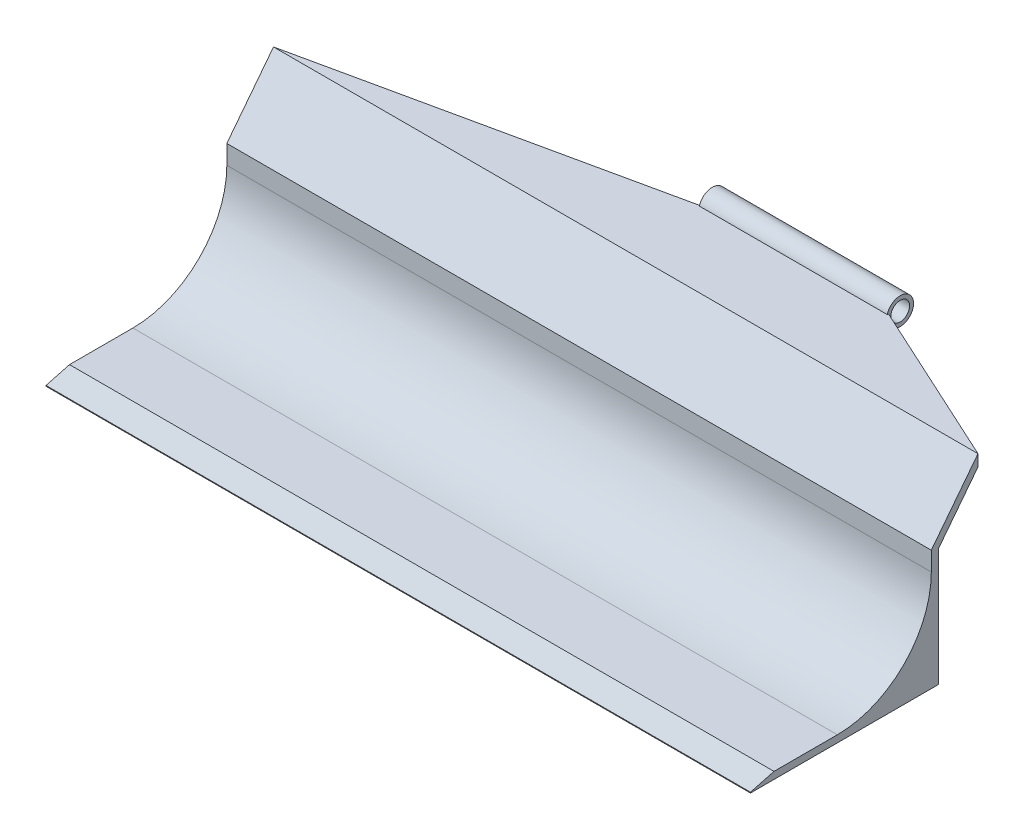
ISO-10303-21;
HEADER;
FILE_DESCRIPTION(('STEP AP214'),'2;1');
FILE_NAME('part.step','',(''),(''),'','','');
FILE_SCHEMA(('AUTOMOTIVE_DESIGN { 1 0 10303 214 1 1 1 1 }'));
ENDSEC;
DATA;
#1=APPLICATION_CONTEXT('core data for automotive mechanical design processes');
#2=APPLICATION_PROTOCOL_DEFINITION('international standard','automotive_design',2000,#1);
#3=PRODUCT_CONTEXT('',#1,'mechanical');
#4=PRODUCT('Part','Part','',(#3));
#5=PRODUCT_RELATED_PRODUCT_CATEGORY('part','',(#4));
#6=PRODUCT_DEFINITION_FORMATION('','',#4);
#7=PRODUCT_DEFINITION_CONTEXT('part definition',#1,'design');
#8=PRODUCT_DEFINITION('design','',#6,#7);
#9=PRODUCT_DEFINITION_SHAPE('','',#8);
#10=(LENGTH_UNIT() NAMED_UNIT(*) SI_UNIT(.MILLI.,.METRE.));
#11=(NAMED_UNIT(*) PLANE_ANGLE_UNIT() SI_UNIT($,.RADIAN.));
#12=(NAMED_UNIT(*) SI_UNIT($,.STERADIAN.) SOLID_ANGLE_UNIT());
#13=UNCERTAINTY_MEASURE_WITH_UNIT(LENGTH_MEASURE(1.E-05),#10,'distance_accuracy_value','');
#14=(GEOMETRIC_REPRESENTATION_CONTEXT(3) GLOBAL_UNCERTAINTY_ASSIGNED_CONTEXT((#13)) GLOBAL_UNIT_ASSIGNED_CONTEXT((#10,
#11,#12)) REPRESENTATION_CONTEXT('',''));
#15=CARTESIAN_POINT('',(0.,0.,0.));
#16=DIRECTION('',(0.,0.,1.));
#17=DIRECTION('',(1.,0.,0.));
#18=AXIS2_PLACEMENT_3D('',#15,#16,#17);
#19=CARTESIAN_POINT('',(300.,15.3974455765808,-106.273520759219));
#20=DIRECTION('',(0.,1.,0.));
#21=DIRECTION('',(0.,0.,1.));
#22=AXIS2_PLACEMENT_3D('',#19,#20,#21);
#23=PLANE('',#22);
#24=DIRECTION('',(0.,0.,-1.));
#25=VECTOR('',#24,1.);
#26=CARTESIAN_POINT('',(149.364416539226,15.3974455765808,-106.273520759219));
#27=LINE('',#26,#25);
#28=CARTESIAN_POINT('',(149.364416539226,15.3974455765808,-136.786178247801));
#29=VERTEX_POINT('',#28);
#30=CARTESIAN_POINT('',(149.364416539226,15.3974455765808,-137.151963568001));
#31=VERTEX_POINT('',#30);
#32=EDGE_CURVE('E58',#29,#31,#27,.T.);
#33=ORIENTED_EDGE('',*,*,#32,.F.);
#34=DIRECTION('',(1.,0.,0.));
#35=VECTOR('',#34,1.);
#36=CARTESIAN_POINT('',(149.364416539226,15.3974455765808,-136.786178247801));
#37=LINE('',#36,#35);
#38=CARTESIAN_POINT('',(229.364416539226,15.3974455765808,-136.786178247801));
#39=VERTEX_POINT('',#38);
#40=EDGE_CURVE('E62',#29,#39,#37,.T.);
#41=ORIENTED_EDGE('',*,*,#40,.T.);
#42=DIRECTION('',(0.,0.,-1.));
#43=VECTOR('',#42,1.);
#44=CARTESIAN_POINT('',(229.364416539226,15.3974455765808,-106.273520759219));
#45=LINE('',#44,#43);
#46=CARTESIAN_POINT('',(229.364416539226,15.3974455765808,-137.289614993244));
#47=VERTEX_POINT('',#46);
#48=EDGE_CURVE('E177',#39,#47,#45,.T.);
#49=ORIENTED_EDGE('',*,*,#48,.T.);
#50=DIRECTION('',(0.908520400379815,0.,0.41784049838868));
#51=VECTOR('',#50,1.);
#52=CARTESIAN_POINT('',(299.44191006579,15.3974455765808,-105.060052719543));
#53=LINE('',#52,#51);
#54=CARTESIAN_POINT('',(296.803438032788,15.3974455765808,-106.273520759219));
#55=VERTEX_POINT('',#54);
#56=EDGE_CURVE('E154',#47,#55,#53,.T.);
#57=ORIENTED_EDGE('',*,*,#56,.T.);
#58=DIRECTION('',(-1.,0.,0.));
#59=VECTOR('',#58,1.);
#60=CARTESIAN_POINT('',(300.,15.3974455765808,-106.273520759219));
#61=LINE('',#60,#59);
#62=CARTESIAN_POINT('',(6.78814092826346,15.3974455765808,-106.273520759219));
#63=VERTEX_POINT('',#62);
#64=EDGE_CURVE('E274',#55,#63,#61,.T.);
#65=ORIENTED_EDGE('',*,*,#64,.T.);
#66=DIRECTION('',(0.977341696957803,0.,-0.211667681490687));
#67=VECTOR('',#66,1.);
#68=CARTESIAN_POINT('',(286.863168269493,15.3974455765808,-166.930742143807));
#69=LINE('',#68,#67);
#70=EDGE_CURVE('E158',#63,#31,#69,.T.);
#71=ORIENTED_EDGE('',*,*,#70,.T.);
#72=EDGE_LOOP('',(#33,#41,#49,#57,#65,#71));
#73=FACE_BOUND('',#72,.T.);
#74=ADVANCED_FACE('F41',(#73),#23,.F.);
#75=CARTESIAN_POINT('',(300.,18.3974455765808,-104.803379808116));
#76=DIRECTION('',(0.,-1.,0.));
#77=DIRECTION('',(0.,0.,-1.));
#78=AXIS2_PLACEMENT_3D('',#75,#76,#77);
#79=PLANE('',#78);
#80=DIRECTION('',(0.,0.,1.));
#81=VECTOR('',#80,1.);
#82=CARTESIAN_POINT('',(149.364416539226,18.3974455765808,-104.803379808116));
#83=LINE('',#82,#81);
#84=CARTESIAN_POINT('',(149.364416539226,18.3974455765808,-137.151963568001));
#85=VERTEX_POINT('',#84);
#86=CARTESIAN_POINT('',(149.364416539226,18.3974455765808,-136.786178247801));
#87=VERTEX_POINT('',#86);
#88=EDGE_CURVE('E182',#85,#87,#83,.T.);
#89=ORIENTED_EDGE('',*,*,#88,.F.);
#90=DIRECTION('',(0.977341696957802,0.,-0.211667681490687));
#91=VECTOR('',#90,1.);
#92=CARTESIAN_POINT('',(150.,18.3974455765808,-137.289614993244));
#93=LINE('',#92,#91);
#94=CARTESIAN_POINT('',(0.,18.3974455765808,-104.803379808116));
#95=VERTEX_POINT('',#94);
#96=EDGE_CURVE('E170',#95,#85,#93,.T.);
#97=ORIENTED_EDGE('',*,*,#96,.F.);
#98=DIRECTION('',(-1.,0.,0.));
#99=VECTOR('',#98,1.);
#100=CARTESIAN_POINT('',(300.,18.3974455765808,-104.803379808116));
#101=LINE('',#100,#99);
#102=CARTESIAN_POINT('',(300.,18.3974455765808,-104.803379808116));
#103=VERTEX_POINT('',#102);
#104=EDGE_CURVE('E167',#103,#95,#101,.T.);
#105=ORIENTED_EDGE('',*,*,#104,.F.);
#106=DIRECTION('',(0.908520400379815,0.,0.41784049838868));
#107=VECTOR('',#106,1.);
#108=CARTESIAN_POINT('',(229.364416539226,18.3974455765808,-137.289614993244));
#109=LINE('',#108,#107);
#110=CARTESIAN_POINT('',(229.364416539226,18.3974455765808,-137.289614993244));
#111=VERTEX_POINT('',#110);
#112=EDGE_CURVE('E151',#111,#103,#109,.T.);
#113=ORIENTED_EDGE('',*,*,#112,.F.);
#114=DIRECTION('',(0.,0.,1.));
#115=VECTOR('',#114,1.);
#116=CARTESIAN_POINT('',(229.364416539226,18.3974455765808,-104.803379808116));
#117=LINE('',#116,#115);
#118=CARTESIAN_POINT('',(229.364416539226,18.3974455765808,-136.786178247801));
#119=VERTEX_POINT('',#118);
#120=EDGE_CURVE('E163',#111,#119,#117,.T.);
#121=ORIENTED_EDGE('',*,*,#120,.T.);
#122=DIRECTION('',(1.,0.,0.));
#123=VECTOR('',#122,1.);
#124=CARTESIAN_POINT('',(149.364416539226,18.3974455765808,-136.786178247801));
#125=LINE('',#124,#123);
#126=EDGE_CURVE('E11',#119,#87,#125,.F.);
#127=ORIENTED_EDGE('',*,*,#126,.T.);
#128=EDGE_LOOP('',(#89,#97,#105,#113,#121,#127));
#129=FACE_BOUND('',#128,.T.);
#130=ADVANCED_FACE('F162',(#129),#79,.F.);
#131=CARTESIAN_POINT('',(150.,-58.3162100456621,-137.289614993244));
#132=DIRECTION('',(0.211667681490687,0.,0.977341696957802));
#133=DIRECTION('',(0.977341696957803,0.,-0.211667681490687));
#134=AXIS2_PLACEMENT_3D('',#131,#132,#133);
#135=PLANE('',#134);
#136=DIRECTION('',(0.,1.,0.));
#137=VECTOR('',#136,1.);
#138=CARTESIAN_POINT('',(149.364416539226,-58.3162100456621,-137.151963568001));
#139=LINE('',#138,#137);
#140=EDGE_CURVE('E51',#31,#85,#139,.T.);
#141=ORIENTED_EDGE('',*,*,#140,.F.);
#142=ORIENTED_EDGE('',*,*,#70,.F.);
#143=DIRECTION('',(0.942834164959056,0.263378927544148,-0.204194216156223));
#144=VECTOR('',#143,1.);
#145=CARTESIAN_POINT('',(258.023977464954,85.5796978187491,-160.68489724364));
#146=LINE('',#145,#144);
#147=CARTESIAN_POINT('',(0.,13.5011913421129,-104.803379808116));
#148=VERTEX_POINT('',#147);
#149=EDGE_CURVE('E200',#148,#63,#146,.T.);
#150=ORIENTED_EDGE('',*,*,#149,.F.);
#151=DIRECTION('',(0.,-1.,0.));
#152=VECTOR('',#151,1.);
#153=CARTESIAN_POINT('',(0.,0.,-104.803379808116));
#154=LINE('',#153,#152);
#155=EDGE_CURVE('E308',#95,#148,#154,.T.);
#156=ORIENTED_EDGE('',*,*,#155,.F.);
#157=ORIENTED_EDGE('',*,*,#96,.T.);
#158=EDGE_LOOP('',(#141,#142,#150,#156,#157));
#159=FACE_BOUND('',#158,.T.);
#160=ADVANCED_FACE('F320',(#159),#135,.F.);
#161=CARTESIAN_POINT('',(300.,-8.27269224897838,-87.9223744292238));
#162=DIRECTION('',(0.,0.,1.));
#163=DIRECTION('',(0.,-1.,0.));
#164=AXIS2_PLACEMENT_3D('',#161,#162,#163);
#165=PLANE('',#164);
#166=DIRECTION('',(0.,1.,0.));
#167=VECTOR('',#166,1.);
#168=CARTESIAN_POINT('',(0.,-8.27269224897838,-87.9223744292238));
#169=LINE('',#168,#167);
#170=CARTESIAN_POINT('',(0.,-58.3162100456621,-87.9223744292238));
#171=VERTEX_POINT('',#170);
#172=CARTESIAN_POINT('',(0.,-8.27269224897838,-87.9223744292238));
#173=VERTEX_POINT('',#172);
#174=EDGE_CURVE('E210',#171,#173,#169,.T.);
#175=ORIENTED_EDGE('',*,*,#174,.T.);
#176=DIRECTION('',(-1.,0.,0.));
#177=VECTOR('',#176,1.);
#178=CARTESIAN_POINT('',(300.,-8.27269224897838,-87.9223744292238));
#179=LINE('',#178,#177);
#180=CARTESIAN_POINT('',(300.,-8.27269224897838,-87.9223744292238));
#181=VERTEX_POINT('',#180);
#182=EDGE_CURVE('E278',#181,#173,#179,.T.);
#183=ORIENTED_EDGE('',*,*,#182,.F.);
#184=DIRECTION('',(0.,1.,0.));
#185=VECTOR('',#184,1.);
#186=CARTESIAN_POINT('',(300.,-8.27269224897838,-87.9223744292238));
#187=LINE('',#186,#185);
#188=CARTESIAN_POINT('',(300.,-58.3162100456621,-87.9223744292238));
#189=VERTEX_POINT('',#188);
#190=EDGE_CURVE('E211',#189,#181,#187,.T.);
#191=ORIENTED_EDGE('',*,*,#190,.F.);
#192=DIRECTION('',(-1.,0.,0.));
#193=VECTOR('',#192,1.);
#194=CARTESIAN_POINT('',(300.,-58.3162100456621,-87.9223744292238));
#195=LINE('',#194,#193);
#196=EDGE_CURVE('E237',#189,#171,#195,.T.);
#197=ORIENTED_EDGE('',*,*,#196,.T.);
#198=EDGE_LOOP('',(#175,#183,#191,#197));
#199=FACE_BOUND('',#198,.T.);
#200=ADVANCED_FACE('F363',(#199),#165,.F.);
#201=CARTESIAN_POINT('',(300.,-8.27269224897838,-87.9223744292238));
#202=DIRECTION('',(0.,0.612713281692178,0.79030527926745));
#203=DIRECTION('',(0.,-0.79030527926745,0.612713281692178));
#204=AXIS2_PLACEMENT_3D('',#201,#202,#203);
#205=PLANE('',#204);
#206=ORIENTED_EDGE('',*,*,#64,.F.);
#207=DIRECTION('',(0.799762975939563,-0.474432826659252,0.367821526428792));
#208=VECTOR('',#207,1.);
#209=CARTESIAN_POINT('',(313.227633598698,5.65433697770524,-98.7198168929941));
#210=LINE('',#209,#208);
#211=CARTESIAN_POINT('',(300.,13.5011913421129,-104.803379808116));
#212=VERTEX_POINT('',#211);
#213=EDGE_CURVE('E206',#55,#212,#210,.T.);
#214=ORIENTED_EDGE('',*,*,#213,.T.);
#215=DIRECTION('',(0.,0.79030527926745,-0.612713281692178));
#216=VECTOR('',#215,1.);
#217=CARTESIAN_POINT('',(300.,-8.27269224897838,-87.9223744292238));
#218=LINE('',#217,#216);
#219=EDGE_CURVE('E215',#181,#212,#218,.T.);
#220=ORIENTED_EDGE('',*,*,#219,.F.);
#221=ORIENTED_EDGE('',*,*,#182,.T.);
#222=DIRECTION('',(0.,0.79030527926745,-0.612713281692178));
#223=VECTOR('',#222,1.);
#224=CARTESIAN_POINT('',(0.,-8.27269224897838,-87.9223744292238));
#225=LINE('',#224,#223);
#226=EDGE_CURVE('E241',#173,#148,#225,.T.);
#227=ORIENTED_EDGE('',*,*,#226,.T.);
#228=ORIENTED_EDGE('',*,*,#149,.T.);
#229=EDGE_LOOP('',(#206,#214,#220,#221,#227,#228));
#230=FACE_BOUND('',#229,.T.);
#231=ADVANCED_FACE('F323',(#230),#205,.F.);
#232=CARTESIAN_POINT('',(300.,-7.2459735846461,-84.9223744292238));
#233=DIRECTION('',(0.,-0.612713281692177,-0.790305279267451));
#234=DIRECTION('',(0.,0.790305279267451,-0.612713281692177));
#235=AXIS2_PLACEMENT_3D('',#232,#233,#234);
#236=PLANE('',#235);
#237=DIRECTION('',(0.,-0.790305279267451,0.612713281692177));
#238=VECTOR('',#237,1.);
#239=CARTESIAN_POINT('',(0.,-7.2459735846461,-84.9223744292238));
#240=LINE('',#239,#238);
#241=CARTESIAN_POINT('',(0.,-7.2459735846461,-84.9223744292238));
#242=VERTEX_POINT('',#241);
#243=EDGE_CURVE('E245',#95,#242,#240,.T.);
#244=ORIENTED_EDGE('',*,*,#243,.T.);
#245=DIRECTION('',(-1.,0.,0.));
#246=VECTOR('',#245,1.);
#247=CARTESIAN_POINT('',(300.,-7.2459735846461,-84.9223744292238));
#248=LINE('',#247,#246);
#249=CARTESIAN_POINT('',(300.,-7.2459735846461,-84.9223744292238));
#250=VERTEX_POINT('',#249);
#251=EDGE_CURVE('E268',#250,#242,#248,.T.);
#252=ORIENTED_EDGE('',*,*,#251,.F.);
#253=DIRECTION('',(0.,-0.790305279267451,0.612713281692177));
#254=VECTOR('',#253,1.);
#255=CARTESIAN_POINT('',(300.,-7.2459735846461,-84.9223744292238));
#256=LINE('',#255,#254);
#257=EDGE_CURVE('E220',#103,#250,#256,.T.);
#258=ORIENTED_EDGE('',*,*,#257,.F.);
#259=ORIENTED_EDGE('',*,*,#104,.T.);
#260=EDGE_LOOP('',(#244,#252,#258,#259));
#261=FACE_BOUND('',#260,.T.);
#262=ADVANCED_FACE('F331',(#261),#236,.F.);
#263=CARTESIAN_POINT('',(300.,-7.2459735846461,-84.9223744292238));
#264=DIRECTION('',(0.,0.,-1.));
#265=DIRECTION('',(-1.,0.,0.));
#266=AXIS2_PLACEMENT_3D('',#263,#264,#265);
#267=PLANE('',#266);
#268=DIRECTION('',(0.,-1.,0.));
#269=VECTOR('',#268,1.);
#270=CARTESIAN_POINT('',(0.,-7.2459735846461,-84.9223744292238));
#271=LINE('',#270,#269);
#272=CARTESIAN_POINT('',(0.,-15.3162100456621,-84.9223744292238));
#273=VERTEX_POINT('',#272);
#274=EDGE_CURVE('E248',#242,#273,#271,.T.);
#275=ORIENTED_EDGE('',*,*,#274,.T.);
#276=DIRECTION('',(-1.,0.,0.));
#277=VECTOR('',#276,1.);
#278=CARTESIAN_POINT('',(300.,-15.3162100456621,-84.9223744292238));
#279=LINE('',#278,#277);
#280=CARTESIAN_POINT('',(300.,-15.3162100456621,-84.9223744292238));
#281=VERTEX_POINT('',#280);
#282=EDGE_CURVE('E286',#273,#281,#279,.F.);
#283=ORIENTED_EDGE('',*,*,#282,.T.);
#284=DIRECTION('',(0.,-1.,0.));
#285=VECTOR('',#284,1.);
#286=CARTESIAN_POINT('',(300.,-7.2459735846461,-84.9223744292238));
#287=LINE('',#286,#285);
#288=EDGE_CURVE('E223',#250,#281,#287,.T.);
#289=ORIENTED_EDGE('',*,*,#288,.F.);
#290=ORIENTED_EDGE('',*,*,#251,.T.);
#291=EDGE_LOOP('',(#275,#283,#289,#290));
#292=FACE_BOUND('',#291,.T.);
#293=ADVANCED_FACE('F334',(#292),#267,.F.);
#294=CARTESIAN_POINT('',(300.,-55.3162100456621,-7.92237442922378));
#295=DIRECTION('',(0.,-1.,0.));
#296=DIRECTION('',(0.,0.,-1.));
#297=AXIS2_PLACEMENT_3D('',#294,#295,#296);
#298=PLANE('',#297);
#299=DIRECTION('',(0.,0.,1.));
#300=VECTOR('',#299,1.);
#301=CARTESIAN_POINT('',(0.,-55.3162100456621,-7.92237442922378));
#302=LINE('',#301,#300);
#303=CARTESIAN_POINT('',(0.,-55.3162100456621,-44.9223744292238));
#304=VERTEX_POINT('',#303);
#305=CARTESIAN_POINT('',(0.,-55.3162100456621,-17.9223744292239));
#306=VERTEX_POINT('',#305);
#307=EDGE_CURVE('E252',#304,#306,#302,.T.);
#308=ORIENTED_EDGE('',*,*,#307,.T.);
#309=DIRECTION('',(1.,0.,0.));
#310=VECTOR('',#309,1.);
#311=CARTESIAN_POINT('',(300.,-55.3162100456621,-17.9223744292239));
#312=LINE('',#311,#310);
#313=CARTESIAN_POINT('',(300.,-55.3162100456621,-17.9223744292239));
#314=VERTEX_POINT('',#313);
#315=EDGE_CURVE('E302',#306,#314,#312,.T.);
#316=ORIENTED_EDGE('',*,*,#315,.T.);
#317=DIRECTION('',(0.,0.,1.));
#318=VECTOR('',#317,1.);
#319=CARTESIAN_POINT('',(300.,-55.3162100456621,-7.92237442922378));
#320=LINE('',#319,#318);
#321=CARTESIAN_POINT('',(300.,-55.3162100456621,-44.9223744292238));
#322=VERTEX_POINT('',#321);
#323=EDGE_CURVE('E227',#322,#314,#320,.T.);
#324=ORIENTED_EDGE('',*,*,#323,.F.);
#325=DIRECTION('',(-1.,0.,0.));
#326=VECTOR('',#325,1.);
#327=CARTESIAN_POINT('',(0.,-55.3162100456621,-44.9223744292238));
#328=LINE('',#327,#326);
#329=EDGE_CURVE('E282',#322,#304,#328,.T.);
#330=ORIENTED_EDGE('',*,*,#329,.T.);
#331=EDGE_LOOP('',(#308,#316,#324,#330));
#332=FACE_BOUND('',#331,.T.);
#333=ADVANCED_FACE('F345',(#332),#298,.F.);
#334=CARTESIAN_POINT('',(300.,-55.3162100456621,-7.92237442922378));
#335=DIRECTION('',(0.,0.,-1.));
#336=DIRECTION('',(-1.,0.,0.));
#337=AXIS2_PLACEMENT_3D('',#334,#335,#336);
#338=PLANE('',#337);
#339=DIRECTION('',(0.,-1.,0.));
#340=VECTOR('',#339,1.);
#341=CARTESIAN_POINT('',(300.,-55.3162100456621,-7.92237442922378));
#342=LINE('',#341,#340);
#343=CARTESIAN_POINT('',(300.,-57.9957019699733,-7.92237442922378));
#344=VERTEX_POINT('',#343);
#345=CARTESIAN_POINT('',(300.,-58.3162100456621,-7.92237442922378));
#346=VERTEX_POINT('',#345);
#347=EDGE_CURVE('E231',#344,#346,#342,.T.);
#348=ORIENTED_EDGE('',*,*,#347,.F.);
#349=DIRECTION('',(-1.,0.,0.));
#350=VECTOR('',#349,1.);
#351=CARTESIAN_POINT('',(300.,-57.9957019699733,-7.92237442922378));
#352=LINE('',#351,#350);
#353=CARTESIAN_POINT('',(0.,-57.9957019699733,-7.92237442922378));
#354=VERTEX_POINT('',#353);
#355=EDGE_CURVE('E295',#344,#354,#352,.T.);
#356=ORIENTED_EDGE('',*,*,#355,.T.);
#357=DIRECTION('',(0.,-1.,0.));
#358=VECTOR('',#357,1.);
#359=CARTESIAN_POINT('',(0.,-55.3162100456621,-7.92237442922378));
#360=LINE('',#359,#358);
#361=CARTESIAN_POINT('',(0.,-58.3162100456621,-7.92237442922378));
#362=VERTEX_POINT('',#361);
#363=EDGE_CURVE('E256',#354,#362,#360,.T.);
#364=ORIENTED_EDGE('',*,*,#363,.T.);
#365=DIRECTION('',(-1.,0.,0.));
#366=VECTOR('',#365,1.);
#367=CARTESIAN_POINT('',(300.,-58.3162100456621,-7.92237442922378));
#368=LINE('',#367,#366);
#369=EDGE_CURVE('E264',#346,#362,#368,.T.);
#370=ORIENTED_EDGE('',*,*,#369,.F.);
#371=EDGE_LOOP('',(#348,#356,#364,#370));
#372=FACE_BOUND('',#371,.T.);
#373=ADVANCED_FACE('F354',(#372),#338,.F.);
#374=CARTESIAN_POINT('',(300.,-58.3162100456621,-7.92237442922378));
#375=DIRECTION('',(0.,1.,0.));
#376=DIRECTION('',(0.,0.,1.));
#377=AXIS2_PLACEMENT_3D('',#374,#375,#376);
#378=PLANE('',#377);
#379=DIRECTION('',(0.,0.,-1.));
#380=VECTOR('',#379,1.);
#381=CARTESIAN_POINT('',(0.,-58.3162100456621,-7.92237442922378));
#382=LINE('',#381,#380);
#383=EDGE_CURVE('E216',#362,#171,#382,.T.);
#384=ORIENTED_EDGE('',*,*,#383,.T.);
#385=ORIENTED_EDGE('',*,*,#196,.F.);
#386=DIRECTION('',(0.,0.,-1.));
#387=VECTOR('',#386,1.);
#388=CARTESIAN_POINT('',(300.,-58.3162100456621,-7.92237442922378));
#389=LINE('',#388,#387);
#390=EDGE_CURVE('E234',#346,#189,#389,.T.);
#391=ORIENTED_EDGE('',*,*,#390,.F.);
#392=ORIENTED_EDGE('',*,*,#369,.T.);
#393=EDGE_LOOP('',(#384,#385,#391,#392));
#394=FACE_BOUND('',#393,.T.);
#395=ADVANCED_FACE('F361',(#394),#378,.F.);
#396=CARTESIAN_POINT('',(300.,0.,0.));
#397=DIRECTION('',(1.,0.,0.));
#398=DIRECTION('',(0.,0.,-1.));
#399=AXIS2_PLACEMENT_3D('',#396,#397,#398);
#400=PLANE('',#399);
#401=DIRECTION('',(0.,-1.,0.));
#402=VECTOR('',#401,1.);
#403=CARTESIAN_POINT('',(300.,0.,-104.803379808116));
#404=LINE('',#403,#402);
#405=EDGE_CURVE('E312',#103,#212,#404,.T.);
#406=ORIENTED_EDGE('',*,*,#405,.F.);
#407=ORIENTED_EDGE('',*,*,#257,.T.);
#408=ORIENTED_EDGE('',*,*,#288,.T.);
#409=CARTESIAN_POINT('',(300.,-15.3162100456621,-44.9223744292238));
#410=DIRECTION('',(1.,0.,0.));
#411=DIRECTION('',(0.,0.,-1.));
#412=AXIS2_PLACEMENT_3D('',#409,#410,#411);
#413=CIRCLE('',#412,40.);
#414=EDGE_CURVE('E292',#281,#322,#413,.F.);
#415=ORIENTED_EDGE('',*,*,#414,.T.);
#416=ORIENTED_EDGE('',*,*,#323,.T.);
#417=DIRECTION('',(0.,0.258819045102518,-0.965925826289069));
#418=VECTOR('',#417,1.);
#419=CARTESIAN_POINT('',(300.,-56.0913202004467,-15.0296239501051));
#420=LINE('',#419,#418);
#421=EDGE_CURVE('E305',#314,#344,#420,.F.);
#422=ORIENTED_EDGE('',*,*,#421,.T.);
#423=ORIENTED_EDGE('',*,*,#347,.T.);
#424=ORIENTED_EDGE('',*,*,#390,.T.);
#425=ORIENTED_EDGE('',*,*,#190,.T.);
#426=ORIENTED_EDGE('',*,*,#219,.T.);
#427=EDGE_LOOP('',(#406,#407,#408,#415,#416,#422,#423,#424,#425,#426));
#428=FACE_BOUND('',#427,.T.);
#429=ADVANCED_FACE('F338',(#428),#400,.T.);
#430=CARTESIAN_POINT('',(0.,0.,0.));
#431=DIRECTION('',(1.,0.,0.));
#432=DIRECTION('',(0.,0.,-1.));
#433=AXIS2_PLACEMENT_3D('',#430,#431,#432);
#434=PLANE('',#433);
#435=ORIENTED_EDGE('',*,*,#243,.F.);
#436=ORIENTED_EDGE('',*,*,#155,.T.);
#437=ORIENTED_EDGE('',*,*,#226,.F.);
#438=ORIENTED_EDGE('',*,*,#174,.F.);
#439=ORIENTED_EDGE('',*,*,#383,.F.);
#440=ORIENTED_EDGE('',*,*,#363,.F.);
#441=DIRECTION('',(0.,-0.258819045102518,0.965925826289069));
#442=VECTOR('',#441,1.);
#443=CARTESIAN_POINT('',(0.,-57.9957019699733,-7.92237442922378));
#444=LINE('',#443,#442);
#445=EDGE_CURVE('E299',#354,#306,#444,.F.);
#446=ORIENTED_EDGE('',*,*,#445,.T.);
#447=ORIENTED_EDGE('',*,*,#307,.F.);
#448=CARTESIAN_POINT('',(0.,-15.3162100456621,-44.9223744292238));
#449=DIRECTION('',(1.,0.,0.));
#450=DIRECTION('',(0.,0.,-1.));
#451=AXIS2_PLACEMENT_3D('',#448,#449,#450);
#452=CIRCLE('',#451,40.);
#453=EDGE_CURVE('E289',#304,#273,#452,.T.);
#454=ORIENTED_EDGE('',*,*,#453,.T.);
#455=ORIENTED_EDGE('',*,*,#274,.F.);
#456=EDGE_LOOP('',(#435,#436,#437,#438,#439,#440,#446,#447,#454,#455));
#457=FACE_BOUND('',#456,.T.);
#458=ADVANCED_FACE('F326',(#457),#434,.F.);
#459=CARTESIAN_POINT('',(300.,-15.3162100456621,-44.9223744292238));
#460=DIRECTION('',(1.,0.,0.));
#461=DIRECTION('',(0.,0.,-1.));
#462=AXIS2_PLACEMENT_3D('',#459,#460,#461);
#463=CYLINDRICAL_SURFACE('',#462,40.);
#464=ORIENTED_EDGE('',*,*,#414,.F.);
#465=ORIENTED_EDGE('',*,*,#282,.F.);
#466=ORIENTED_EDGE('',*,*,#453,.F.);
#467=ORIENTED_EDGE('',*,*,#329,.F.);
#468=EDGE_LOOP('',(#464,#465,#466,#467));
#469=FACE_BOUND('',#468,.T.);
#470=ADVANCED_FACE('F342',(#469),#463,.F.);
#471=CARTESIAN_POINT('',(300.,-57.9957019699733,-7.92237442922378));
#472=DIRECTION('',(0.,-0.965925826289069,-0.258819045102518));
#473=DIRECTION('',(-1.,0.,0.));
#474=AXIS2_PLACEMENT_3D('',#471,#472,#473);
#475=PLANE('',#474);
#476=ORIENTED_EDGE('',*,*,#421,.F.);
#477=ORIENTED_EDGE('',*,*,#315,.F.);
#478=ORIENTED_EDGE('',*,*,#445,.F.);
#479=ORIENTED_EDGE('',*,*,#355,.F.);
#480=EDGE_LOOP('',(#476,#477,#478,#479));
#481=FACE_BOUND('',#480,.T.);
#482=ADVANCED_FACE('F44',(#481),#475,.F.);
#483=CARTESIAN_POINT('',(229.364416539226,-58.3162100456621,-137.289614993244));
#484=DIRECTION('',(-0.41784049838868,0.,0.908520400379815));
#485=DIRECTION('',(0.908520400379815,0.,0.41784049838868));
#486=AXIS2_PLACEMENT_3D('',#483,#484,#485);
#487=PLANE('',#486);
#488=ORIENTED_EDGE('',*,*,#56,.F.);
#489=DIRECTION('',(0.,1.,0.));
#490=VECTOR('',#489,1.);
#491=CARTESIAN_POINT('',(229.364416539226,-58.3162100456621,-137.289614993244));
#492=LINE('',#491,#490);
#493=EDGE_CURVE('E148',#47,#111,#492,.T.);
#494=ORIENTED_EDGE('',*,*,#493,.T.);
#495=ORIENTED_EDGE('',*,*,#112,.T.);
#496=ORIENTED_EDGE('',*,*,#405,.T.);
#497=ORIENTED_EDGE('',*,*,#213,.F.);
#498=EDGE_LOOP('',(#488,#494,#495,#496,#497));
#499=FACE_BOUND('',#498,.T.);
#500=ADVANCED_FACE('F150',(#499),#487,.F.);
#501=CARTESIAN_POINT('',(229.364416539226,18.3974455765808,-147.289614993244));
#502=DIRECTION('',(-1.,0.,0.));
#503=DIRECTION('',(0.,0.,1.));
#504=AXIS2_PLACEMENT_3D('',#501,#502,#503);
#505=PLANE('',#504);
#506=CARTESIAN_POINT('',(229.364416539226,16.8974455765808,-142.289614993244));
#507=DIRECTION('',(1.,0.,0.));
#508=DIRECTION('',(0.,0.,-1.));
#509=AXIS2_PLACEMENT_3D('',#506,#507,#508);
#510=CIRCLE('',#509,3.99999999999999);
#511=CARTESIAN_POINT('',(229.364416539226,16.8974455765808,-146.289614993244));
#512=VERTEX_POINT('',#511);
#513=EDGE_CURVE('E413',#512,#512,#510,.T.);
#514=ORIENTED_EDGE('',*,*,#513,.F.);
#515=EDGE_LOOP('',(#514));
#516=FACE_BOUND('',#515,.T.);
#517=ORIENTED_EDGE('',*,*,#493,.F.);
#518=ORIENTED_EDGE('',*,*,#48,.F.);
#519=CARTESIAN_POINT('',(229.364416539226,16.8974455765808,-142.289614993244));
#520=DIRECTION('',(1.,0.,0.));
#521=DIRECTION('',(0.,0.,-1.));
#522=AXIS2_PLACEMENT_3D('',#519,#520,#521);
#523=CIRCLE('',#522,5.70419284483686);
#524=EDGE_CURVE('E175',#39,#119,#523,.T.);
#525=ORIENTED_EDGE('',*,*,#524,.T.);
#526=ORIENTED_EDGE('',*,*,#120,.F.);
#527=EDGE_LOOP('',(#517,#518,#525,#526));
#528=FACE_BOUND('',#527,.T.);
#529=ADVANCED_FACE('F173',(#516,#528),#505,.F.);
#530=CARTESIAN_POINT('',(149.364416539226,16.8974455765808,-142.289614993244));
#531=DIRECTION('',(1.,0.,0.));
#532=DIRECTION('',(0.,0.,-1.));
#533=AXIS2_PLACEMENT_3D('',#530,#531,#532);
#534=CYLINDRICAL_SURFACE('',#533,5.70419284483686);
#535=ORIENTED_EDGE('',*,*,#40,.F.);
#536=CARTESIAN_POINT('',(149.364416539226,16.8974455765808,-142.289614993244));
#537=DIRECTION('',(1.,0.,0.));
#538=DIRECTION('',(0.,0.,-1.));
#539=AXIS2_PLACEMENT_3D('',#536,#537,#538);
#540=CIRCLE('',#539,5.70419284483686);
#541=EDGE_CURVE('E178',#29,#87,#540,.T.);
#542=ORIENTED_EDGE('',*,*,#541,.T.);
#543=ORIENTED_EDGE('',*,*,#126,.F.);
#544=ORIENTED_EDGE('',*,*,#524,.F.);
#545=EDGE_LOOP('',(#535,#542,#543,#544));
#546=FACE_BOUND('',#545,.T.);
#547=ADVANCED_FACE('F397',(#546),#534,.T.);
#548=CARTESIAN_POINT('',(149.364416539226,16.8974455765808,-142.289614993244));
#549=DIRECTION('',(1.,0.,0.));
#550=DIRECTION('',(0.,0.,-1.));
#551=AXIS2_PLACEMENT_3D('',#548,#549,#550);
#552=PLANE('',#551);
#553=CARTESIAN_POINT('',(149.364416539226,16.8974455765808,-142.289614993244));
#554=DIRECTION('',(1.,0.,0.));
#555=DIRECTION('',(0.,0.,-1.));
#556=AXIS2_PLACEMENT_3D('',#553,#554,#555);
#557=CIRCLE('',#556,3.99999999999999);
#558=CARTESIAN_POINT('',(149.364416539226,16.8974455765808,-146.289614993244));
#559=VERTEX_POINT('',#558);
#560=EDGE_CURVE('E416',#559,#559,#557,.T.);
#561=ORIENTED_EDGE('',*,*,#560,.T.);
#562=EDGE_LOOP('',(#561));
#563=FACE_BOUND('',#562,.T.);
#564=ORIENTED_EDGE('',*,*,#541,.F.);
#565=ORIENTED_EDGE('',*,*,#32,.T.);
#566=ORIENTED_EDGE('',*,*,#140,.T.);
#567=ORIENTED_EDGE('',*,*,#88,.T.);
#568=EDGE_LOOP('',(#564,#565,#566,#567));
#569=FACE_BOUND('',#568,.T.);
#570=ADVANCED_FACE('F318',(#563,#569),#552,.F.);
#571=CARTESIAN_POINT('',(149.364416539226,16.8974455765808,-142.289614993244));
#572=DIRECTION('',(1.,0.,0.));
#573=DIRECTION('',(0.,0.,-1.));
#574=AXIS2_PLACEMENT_3D('',#571,#572,#573);
#575=CYLINDRICAL_SURFACE('',#574,3.99999999999999);
#576=ORIENTED_EDGE('',*,*,#513,.T.);
#577=EDGE_LOOP('',(#576));
#578=FACE_BOUND('',#577,.T.);
#579=ORIENTED_EDGE('',*,*,#560,.F.);
#580=EDGE_LOOP('',(#579));
#581=FACE_BOUND('',#580,.T.);
#582=ADVANCED_FACE('F404',(#578,#581),#575,.F.);
#583=CLOSED_SHELL('',(#74,#130,#160,#200,#231,#262,#293,#333,#373,#395,#429,#458,#470,#482,#500,
#529,#547,#570,#582));
#584=MANIFOLD_SOLID_BREP('B2',#583);
#585=ADVANCED_BREP_SHAPE_REPRESENTATION('',(#18,#584),#14);
#586=SHAPE_DEFINITION_REPRESENTATION(#9,#585);
ENDSEC;
END-ISO-10303-21;
